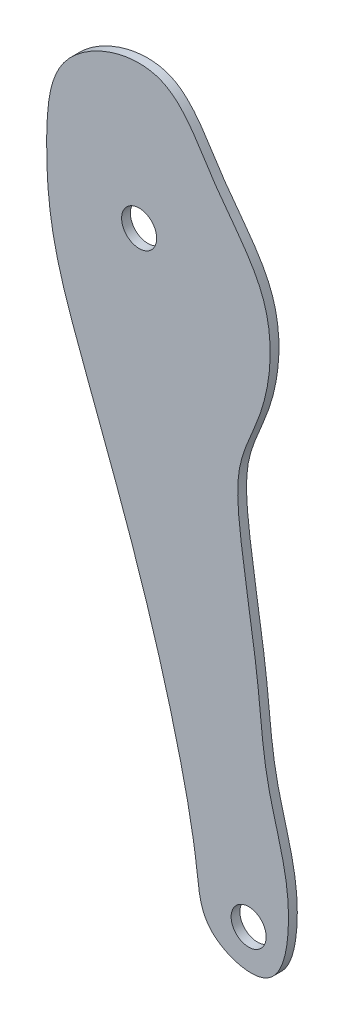
ISO-10303-21;
HEADER;
FILE_DESCRIPTION(('STEP AP214'),'2;1');
FILE_NAME('part.step','',(''),(''),'','','');
FILE_SCHEMA(('AUTOMOTIVE_DESIGN { 1 0 10303 214 1 1 1 1 }'));
ENDSEC;
DATA;
#1=APPLICATION_CONTEXT('core data for automotive mechanical design processes');
#2=APPLICATION_PROTOCOL_DEFINITION('international standard','automotive_design',2000,#1);
#3=PRODUCT_CONTEXT('',#1,'mechanical');
#4=PRODUCT('Part','Part','',(#3));
#5=PRODUCT_RELATED_PRODUCT_CATEGORY('part','',(#4));
#6=PRODUCT_DEFINITION_FORMATION('','',#4);
#7=PRODUCT_DEFINITION_CONTEXT('part definition',#1,'design');
#8=PRODUCT_DEFINITION('design','',#6,#7);
#9=PRODUCT_DEFINITION_SHAPE('','',#8);
#10=(LENGTH_UNIT() NAMED_UNIT(*) SI_UNIT(.MILLI.,.METRE.));
#11=(NAMED_UNIT(*) PLANE_ANGLE_UNIT() SI_UNIT($,.RADIAN.));
#12=(NAMED_UNIT(*) SI_UNIT($,.STERADIAN.) SOLID_ANGLE_UNIT());
#13=UNCERTAINTY_MEASURE_WITH_UNIT(LENGTH_MEASURE(1.E-05),#10,'distance_accuracy_value','');
#14=(GEOMETRIC_REPRESENTATION_CONTEXT(3) GLOBAL_UNCERTAINTY_ASSIGNED_CONTEXT((#13)) GLOBAL_UNIT_ASSIGNED_CONTEXT((#10,
#11,#12)) REPRESENTATION_CONTEXT('',''));
#15=CARTESIAN_POINT('',(0.,0.,0.));
#16=DIRECTION('',(0.,0.,1.));
#17=DIRECTION('',(1.,0.,0.));
#18=AXIS2_PLACEMENT_3D('',#15,#16,#17);
#19=CARTESIAN_POINT('',(24.1464134898563,181.865144367403,2.18276937891608));
#20=DIRECTION('',(0.,0.,1.));
#21=DIRECTION('',(1.,0.,0.));
#22=AXIS2_PLACEMENT_3D('',#19,#20,#21);
#23=PLANE('',#22);
#24=CARTESIAN_POINT('',(30.8774363162314,93.4294382158945,2.18276937891608));
#25=DIRECTION('',(0.,0.,1.));
#26=DIRECTION('',(1.,0.,0.));
#27=AXIS2_PLACEMENT_3D('',#24,#25,#26);
#28=CIRCLE('',#27,2.38124999999999);
#29=CARTESIAN_POINT('',(33.2586863162314,93.4294382158945,2.18276937891608));
#30=VERTEX_POINT('',#29);
#31=EDGE_CURVE('E91',#30,#30,#28,.T.);
#32=ORIENTED_EDGE('',*,*,#31,.F.);
#33=EDGE_LOOP('',(#32));
#34=FACE_BOUND('',#33,.T.);
#35=CARTESIAN_POINT('',(16.0057971411218,168.164131285749,2.18276937891608));
#36=DIRECTION('',(0.,0.,1.));
#37=DIRECTION('',(1.,0.,0.));
#38=AXIS2_PLACEMENT_3D('',#35,#36,#37);
#39=CIRCLE('',#38,2.38125);
#40=CARTESIAN_POINT('',(18.3870471411218,168.164131285749,2.18276937891608));
#41=VERTEX_POINT('',#40);
#42=EDGE_CURVE('E74',#41,#41,#39,.T.);
#43=ORIENTED_EDGE('',*,*,#42,.F.);
#44=EDGE_LOOP('',(#43));
#45=FACE_BOUND('',#44,.T.);
#46=CARTESIAN_POINT('',(23.8895886150292,96.2714614165454,2.18276937891608));
#47=CARTESIAN_POINT('',(24.1276007777651,94.3050201720617,2.18276937891608));
#48=CARTESIAN_POINT('',(24.5374836188994,89.4703649436223,2.18276937891608));
#49=CARTESIAN_POINT('',(34.8997653713735,86.2994148236948,2.18276937891608));
#50=CARTESIAN_POINT('',(36.7398565099006,96.3872374834641,2.18276937891608));
#51=CARTESIAN_POINT('',(35.6827928093488,103.908461404902,2.18276937891608));
#52=CARTESIAN_POINT('',(32.9279427721928,112.48878127773,2.18276937891608));
#53=CARTESIAN_POINT('',(32.194210856193,124.631420173834,2.18276937891608));
#54=CARTESIAN_POINT('',(29.890771870034,136.114341464021,2.18276937891608));
#55=CARTESIAN_POINT('',(28.9740785679835,147.291440050161,2.18276937891608));
#56=CARTESIAN_POINT('',(33.7111803060772,155.935796616433,2.18276937891608));
#57=CARTESIAN_POINT('',(34.7791082775911,168.724697717962,2.18276937891608));
#58=CARTESIAN_POINT('',(26.0344025840288,177.800187013078,2.18276937891608));
#59=CARTESIAN_POINT('',(19.7478635100276,190.491700913439,2.18276937891608));
#60=CARTESIAN_POINT('',(4.30507098993313,184.810200284916,2.18276937891608));
#61=CARTESIAN_POINT('',(3.15590722751859,172.264540638113,2.18276937891608));
#62=CARTESIAN_POINT('',(3.87235261680481,160.795874231129,2.18276937891608));
#63=CARTESIAN_POINT('',(9.41015366541317,145.731019782287,2.18276937891608));
#64=CARTESIAN_POINT('',(15.8978890676538,128.972588771053,2.18276937891608));
#65=CARTESIAN_POINT('',(21.0973123871373,111.276211613408,2.18276937891608));
#66=CARTESIAN_POINT('',(23.3286654986527,100.905772278428,2.18276937891608));
#67=CARTESIAN_POINT('',(23.8895886150292,96.2714614165454,2.18276937891608));
#68=B_SPLINE_CURVE_WITH_KNOTS('',3,(#46,#47,#48,#49,#50,#51,#52,#53,#54,#55,#56,#57,#58,#59,#60,
#61,#62,#63,#64,#65,#66,#67),.UNSPECIFIED.,.T.,.F.,(4,1,1,1,1,1,1,1,1,1,1,1,1,1,1,1,1,1,1,4),
(0.,0.0259073570697629,0.0619452473303499,0.0992102035765138,0.132366351871884,0.17072332122236,
0.21845226876794,0.296194230278391,0.3308687932759,0.365117885399431,0.427752650873393,
0.485935554621899,0.533485289306182,0.596799764894152,0.638978483190821,0.69468470254547,
0.752921317968131,0.853626280168319,0.938944147653603,1.),.UNSPECIFIED.);
#69=CARTESIAN_POINT('',(23.8895886150292,96.2714614165454,2.18276937891608));
#70=VERTEX_POINT('',#69);
#71=EDGE_CURVE('E11',#70,#70,#68,.T.);
#72=ORIENTED_EDGE('',*,*,#71,.T.);
#73=EDGE_LOOP('',(#72));
#74=FACE_BOUND('',#73,.T.);
#75=ADVANCED_FACE('F55',(#34,#45,#74),#23,.T.);
#76=CARTESIAN_POINT('',(24.1464134898563,181.865144367403,0.992144378916084));
#77=DIRECTION('',(0.,0.,1.));
#78=DIRECTION('',(1.,0.,0.));
#79=AXIS2_PLACEMENT_3D('',#76,#77,#78);
#80=PLANE('',#79);
#81=CARTESIAN_POINT('',(30.8774363162314,93.4294382158945,0.992144378916085));
#82=DIRECTION('',(0.,0.,1.));
#83=DIRECTION('',(1.,0.,0.));
#84=AXIS2_PLACEMENT_3D('',#81,#82,#83);
#85=CIRCLE('',#84,2.38124999999999);
#86=CARTESIAN_POINT('',(33.2586863162314,93.4294382158945,0.992144378916085));
#87=VERTEX_POINT('',#86);
#88=EDGE_CURVE('E60',#87,#87,#85,.T.);
#89=ORIENTED_EDGE('',*,*,#88,.T.);
#90=EDGE_LOOP('',(#89));
#91=FACE_BOUND('',#90,.T.);
#92=CARTESIAN_POINT('',(16.0057971411218,168.164131285749,0.992144378916085));
#93=DIRECTION('',(0.,0.,1.));
#94=DIRECTION('',(1.,0.,0.));
#95=AXIS2_PLACEMENT_3D('',#92,#93,#94);
#96=CIRCLE('',#95,2.38125);
#97=CARTESIAN_POINT('',(18.3870471411218,168.164131285749,0.992144378916085));
#98=VERTEX_POINT('',#97);
#99=EDGE_CURVE('E68',#98,#98,#96,.T.);
#100=ORIENTED_EDGE('',*,*,#99,.T.);
#101=EDGE_LOOP('',(#100));
#102=FACE_BOUND('',#101,.T.);
#103=CARTESIAN_POINT('',(23.8895886150292,96.2714614165454,0.992144378916084));
#104=CARTESIAN_POINT('',(24.1276007777651,94.3050201720617,0.992144378916084));
#105=CARTESIAN_POINT('',(24.5374836188994,89.4703649436223,0.992144378916084));
#106=CARTESIAN_POINT('',(34.8997653713735,86.2994148236948,0.992144378916084));
#107=CARTESIAN_POINT('',(36.7398565099006,96.3872374834641,0.992144378916084));
#108=CARTESIAN_POINT('',(35.6827928093488,103.908461404902,0.992144378916084));
#109=CARTESIAN_POINT('',(32.9279427721928,112.48878127773,0.992144378916084));
#110=CARTESIAN_POINT('',(32.194210856193,124.631420173834,0.992144378916084));
#111=CARTESIAN_POINT('',(29.890771870034,136.114341464021,0.992144378916084));
#112=CARTESIAN_POINT('',(28.9740785679835,147.291440050161,0.992144378916084));
#113=CARTESIAN_POINT('',(33.7111803060772,155.935796616433,0.992144378916084));
#114=CARTESIAN_POINT('',(34.7791082775911,168.724697717962,0.992144378916084));
#115=CARTESIAN_POINT('',(26.0344025840288,177.800187013078,0.992144378916084));
#116=CARTESIAN_POINT('',(19.7478635100276,190.491700913439,0.992144378916084));
#117=CARTESIAN_POINT('',(4.30507098993313,184.810200284916,0.992144378916084));
#118=CARTESIAN_POINT('',(3.15590722751859,172.264540638113,0.992144378916084));
#119=CARTESIAN_POINT('',(3.87235261680481,160.795874231129,0.992144378916084));
#120=CARTESIAN_POINT('',(9.41015366541317,145.731019782287,0.992144378916084));
#121=CARTESIAN_POINT('',(15.8978890676538,128.972588771053,0.992144378916084));
#122=CARTESIAN_POINT('',(21.0973123871373,111.276211613408,0.992144378916084));
#123=CARTESIAN_POINT('',(23.3286654986527,100.905772278428,0.992144378916084));
#124=CARTESIAN_POINT('',(23.8895886150292,96.2714614165454,0.992144378916084));
#125=B_SPLINE_CURVE_WITH_KNOTS('',3,(#103,#104,#105,#106,#107,#108,#109,#110,#111,#112,#113,
#114,#115,#116,#117,#118,#119,#120,#121,#122,#123,#124),.UNSPECIFIED.,.T.,.F.,(4,1,1,1,1,1,1,1,
1,1,1,1,1,1,1,1,1,1,1,4),(0.,0.0259073570697629,0.0619452473303499,0.0992102035765138,
0.132366351871884,0.17072332122236,0.21845226876794,0.296194230278391,0.3308687932759,
0.365117885399431,0.427752650873393,0.485935554621899,0.533485289306182,0.596799764894152,
0.638978483190821,0.69468470254547,0.752921317968131,0.853626280168319,0.938944147653603,1.),.UNSPECIFIED.);
#126=CARTESIAN_POINT('',(23.8895886150292,96.2714614165454,0.992144378916084));
#127=VERTEX_POINT('',#126);
#128=EDGE_CURVE('E64',#127,#127,#125,.T.);
#129=ORIENTED_EDGE('',*,*,#128,.F.);
#130=EDGE_LOOP('',(#129));
#131=FACE_BOUND('',#130,.T.);
#132=ADVANCED_FACE('F102',(#91,#102,#131),#80,.F.);
#133=DIRECTION('',(0.,0.,-1.));
#134=VECTOR('',#133,1.);
#135=SURFACE_OF_LINEAR_EXTRUSION('',#68,#134);
#136=ORIENTED_EDGE('',*,*,#71,.F.);
#137=EDGE_LOOP('',(#136));
#138=FACE_BOUND('',#137,.T.);
#139=ORIENTED_EDGE('',*,*,#128,.T.);
#140=EDGE_LOOP('',(#139));
#141=FACE_BOUND('',#140,.T.);
#142=ADVANCED_FACE('F57',(#138,#141),#135,.F.);
#143=CARTESIAN_POINT('',(16.0057971411218,168.164131285749,-0.992230621083915));
#144=DIRECTION('',(0.,0.,1.));
#145=DIRECTION('',(1.,0.,0.));
#146=AXIS2_PLACEMENT_3D('',#143,#144,#145);
#147=CYLINDRICAL_SURFACE('',#146,2.38125);
#148=ORIENTED_EDGE('',*,*,#42,.T.);
#149=EDGE_LOOP('',(#148));
#150=FACE_BOUND('',#149,.T.);
#151=ORIENTED_EDGE('',*,*,#99,.F.);
#152=EDGE_LOOP('',(#151));
#153=FACE_BOUND('',#152,.T.);
#154=ADVANCED_FACE('F109',(#150,#153),#147,.F.);
#155=CARTESIAN_POINT('',(30.8774363162314,93.4294382158945,-0.992230621083915));
#156=DIRECTION('',(0.,0.,1.));
#157=DIRECTION('',(1.,0.,0.));
#158=AXIS2_PLACEMENT_3D('',#155,#156,#157);
#159=CYLINDRICAL_SURFACE('',#158,2.38124999999999);
#160=ORIENTED_EDGE('',*,*,#31,.T.);
#161=EDGE_LOOP('',(#160));
#162=FACE_BOUND('',#161,.T.);
#163=ORIENTED_EDGE('',*,*,#88,.F.);
#164=EDGE_LOOP('',(#163));
#165=FACE_BOUND('',#164,.T.);
#166=ADVANCED_FACE('F97',(#162,#165),#159,.F.);
#167=CLOSED_SHELL('',(#75,#132,#142,#154,#166));
#168=MANIFOLD_SOLID_BREP('B2',#167);
#169=ADVANCED_BREP_SHAPE_REPRESENTATION('',(#18,#168),#14);
#170=SHAPE_DEFINITION_REPRESENTATION(#9,#169);
ENDSEC;
END-ISO-10303-21;
